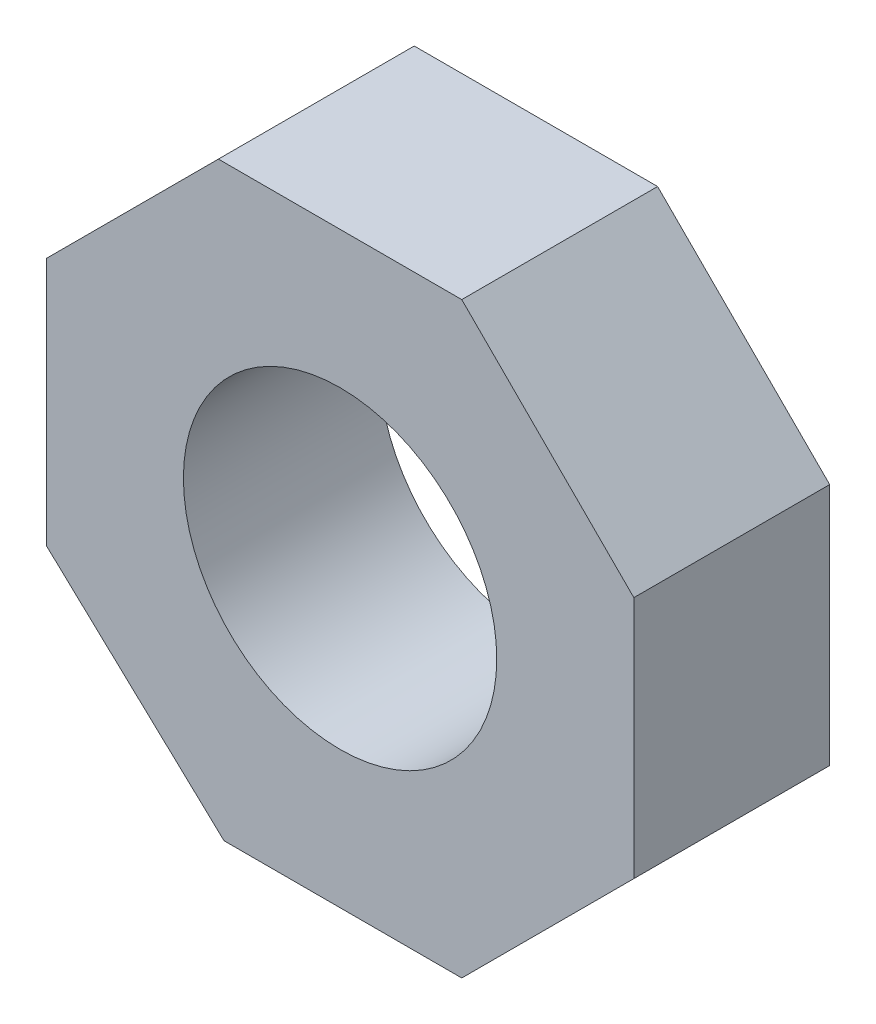
ISO-10303-21;
HEADER;
FILE_DESCRIPTION(('STEP AP214'),'2;1');
FILE_NAME('part.step','',(''),(''),'','','');
FILE_SCHEMA(('AUTOMOTIVE_DESIGN { 1 0 10303 214 1 1 1 1 }'));
ENDSEC;
DATA;
#1=APPLICATION_CONTEXT('core data for automotive mechanical design processes');
#2=APPLICATION_PROTOCOL_DEFINITION('international standard','automotive_design',2000,#1);
#3=PRODUCT_CONTEXT('',#1,'mechanical');
#4=PRODUCT('Part','Part','',(#3));
#5=PRODUCT_RELATED_PRODUCT_CATEGORY('part','',(#4));
#6=PRODUCT_DEFINITION_FORMATION('','',#4);
#7=PRODUCT_DEFINITION_CONTEXT('part definition',#1,'design');
#8=PRODUCT_DEFINITION('design','',#6,#7);
#9=PRODUCT_DEFINITION_SHAPE('','',#8);
#10=(LENGTH_UNIT() NAMED_UNIT(*) SI_UNIT(.MILLI.,.METRE.));
#11=(NAMED_UNIT(*) PLANE_ANGLE_UNIT() SI_UNIT($,.RADIAN.));
#12=(NAMED_UNIT(*) SI_UNIT($,.STERADIAN.) SOLID_ANGLE_UNIT());
#13=UNCERTAINTY_MEASURE_WITH_UNIT(LENGTH_MEASURE(1.E-05),#10,'distance_accuracy_value','');
#14=(GEOMETRIC_REPRESENTATION_CONTEXT(3) GLOBAL_UNCERTAINTY_ASSIGNED_CONTEXT((#13)) GLOBAL_UNIT_ASSIGNED_CONTEXT((#10,
#11,#12)) REPRESENTATION_CONTEXT('',''));
#15=CARTESIAN_POINT('',(0.,0.,0.));
#16=DIRECTION('',(0.,0.,1.));
#17=DIRECTION('',(1.,0.,0.));
#18=AXIS2_PLACEMENT_3D('',#15,#16,#17);
#19=CARTESIAN_POINT('',(-5.12900574695607,-5.46682549164767,5.));
#20=DIRECTION('',(0.68421491435658,0.729280433696132,0.));
#21=DIRECTION('',(-0.729280433696132,0.68421491435658,0.));
#22=AXIS2_PLACEMENT_3D('',#19,#20,#21);
#23=PLANE('',#22);
#24=DIRECTION('',(0.729280433696132,-0.68421491435658,0.));
#25=VECTOR('',#24,1.);
#26=CARTESIAN_POINT('',(-5.12900574695607,-5.46682549164767,0.));
#27=LINE('',#26,#25);
#28=CARTESIAN_POINT('',(-7.49999999999999,-3.2423456416064,0.));
#29=VERTEX_POINT('',#28);
#30=CARTESIAN_POINT('',(-2.96191707917186,-7.49999999999998,0.));
#31=VERTEX_POINT('',#30);
#32=EDGE_CURVE('E138',#29,#31,#27,.T.);
#33=ORIENTED_EDGE('',*,*,#32,.T.);
#34=DIRECTION('',(0.,0.,-1.));
#35=VECTOR('',#34,1.);
#36=CARTESIAN_POINT('',(-2.96191707917186,-7.49999999999998,5.));
#37=LINE('',#36,#35);
#38=CARTESIAN_POINT('',(-2.96191707917186,-7.49999999999998,5.));
#39=VERTEX_POINT('',#38);
#40=EDGE_CURVE('E11',#39,#31,#37,.T.);
#41=ORIENTED_EDGE('',*,*,#40,.F.);
#42=DIRECTION('',(0.729280433696132,-0.68421491435658,0.));
#43=VECTOR('',#42,1.);
#44=CARTESIAN_POINT('',(-5.12900574695607,-5.46682549164767,5.));
#45=LINE('',#44,#43);
#46=CARTESIAN_POINT('',(-7.49999999999999,-3.2423456416064,5.));
#47=VERTEX_POINT('',#46);
#48=EDGE_CURVE('E183',#47,#39,#45,.T.);
#49=ORIENTED_EDGE('',*,*,#48,.F.);
#50=DIRECTION('',(0.,0.,-1.));
#51=VECTOR('',#50,1.);
#52=CARTESIAN_POINT('',(-7.49999999999999,-3.2423456416064,5.));
#53=LINE('',#52,#51);
#54=EDGE_CURVE('E54',#47,#29,#53,.T.);
#55=ORIENTED_EDGE('',*,*,#54,.T.);
#56=EDGE_LOOP('',(#33,#41,#49,#55));
#57=FACE_BOUND('',#56,.T.);
#58=ADVANCED_FACE('F37',(#57),#23,.F.);
#59=CARTESIAN_POINT('',(0.,-7.49999999999998,5.));
#60=DIRECTION('',(0.,1.,0.));
#61=DIRECTION('',(-1.,0.,0.));
#62=AXIS2_PLACEMENT_3D('',#59,#60,#61);
#63=PLANE('',#62);
#64=DIRECTION('',(1.,0.,0.));
#65=VECTOR('',#64,1.);
#66=CARTESIAN_POINT('',(0.,-7.49999999999998,0.));
#67=LINE('',#66,#65);
#68=CARTESIAN_POINT('',(3.10660171779821,-7.49999999999998,0.));
#69=VERTEX_POINT('',#68);
#70=EDGE_CURVE('E140',#31,#69,#67,.T.);
#71=ORIENTED_EDGE('',*,*,#70,.T.);
#72=DIRECTION('',(0.,0.,-1.));
#73=VECTOR('',#72,1.);
#74=CARTESIAN_POINT('',(3.10660171779821,-7.49999999999998,5.));
#75=LINE('',#74,#73);
#76=CARTESIAN_POINT('',(3.10660171779821,-7.49999999999998,5.));
#77=VERTEX_POINT('',#76);
#78=EDGE_CURVE('E46',#77,#69,#75,.T.);
#79=ORIENTED_EDGE('',*,*,#78,.F.);
#80=DIRECTION('',(1.,0.,0.));
#81=VECTOR('',#80,1.);
#82=CARTESIAN_POINT('',(0.,-7.49999999999998,5.));
#83=LINE('',#82,#81);
#84=EDGE_CURVE('E92',#39,#77,#83,.T.);
#85=ORIENTED_EDGE('',*,*,#84,.F.);
#86=ORIENTED_EDGE('',*,*,#40,.T.);
#87=EDGE_LOOP('',(#71,#79,#85,#86));
#88=FACE_BOUND('',#87,.T.);
#89=ADVANCED_FACE('F171',(#88),#63,.F.);
#90=CARTESIAN_POINT('',(5.30330085889909,-5.3033008588991,5.));
#91=DIRECTION('',(0.707106781186547,-0.707106781186548,0.));
#92=DIRECTION('',(0.707106781186548,0.707106781186547,0.));
#93=AXIS2_PLACEMENT_3D('',#90,#91,#92);
#94=PLANE('',#93);
#95=DIRECTION('',(-0.707106781186548,-0.707106781186547,0.));
#96=VECTOR('',#95,1.);
#97=CARTESIAN_POINT('',(5.30330085889909,-5.3033008588991,0.));
#98=LINE('',#97,#96);
#99=CARTESIAN_POINT('',(7.49999999999998,-3.10660171779822,0.));
#100=VERTEX_POINT('',#99);
#101=EDGE_CURVE('E143',#100,#69,#98,.T.);
#102=ORIENTED_EDGE('',*,*,#101,.F.);
#103=DIRECTION('',(0.,0.,-1.));
#104=VECTOR('',#103,1.);
#105=CARTESIAN_POINT('',(7.49999999999998,-3.10660171779822,5.));
#106=LINE('',#105,#104);
#107=CARTESIAN_POINT('',(7.49999999999998,-3.10660171779822,5.));
#108=VERTEX_POINT('',#107);
#109=EDGE_CURVE('E164',#108,#100,#106,.T.);
#110=ORIENTED_EDGE('',*,*,#109,.F.);
#111=DIRECTION('',(-0.707106781186548,-0.707106781186547,0.));
#112=VECTOR('',#111,1.);
#113=CARTESIAN_POINT('',(5.30330085889909,-5.3033008588991,5.));
#114=LINE('',#113,#112);
#115=EDGE_CURVE('E170',#108,#77,#114,.T.);
#116=ORIENTED_EDGE('',*,*,#115,.T.);
#117=ORIENTED_EDGE('',*,*,#78,.T.);
#118=EDGE_LOOP('',(#102,#110,#116,#117));
#119=FACE_BOUND('',#118,.T.);
#120=ADVANCED_FACE('F168',(#119),#94,.T.);
#121=CARTESIAN_POINT('',(7.49999999999996,0.,5.));
#122=DIRECTION('',(1.,0.,0.));
#123=DIRECTION('',(0.,1.,0.));
#124=AXIS2_PLACEMENT_3D('',#121,#122,#123);
#125=PLANE('',#124);
#126=DIRECTION('',(0.,-1.,0.));
#127=VECTOR('',#126,1.);
#128=CARTESIAN_POINT('',(7.49999999999996,0.,0.));
#129=LINE('',#128,#127);
#130=CARTESIAN_POINT('',(7.49999999999994,3.10660171779828,0.));
#131=VERTEX_POINT('',#130);
#132=EDGE_CURVE('E146',#131,#100,#129,.T.);
#133=ORIENTED_EDGE('',*,*,#132,.F.);
#134=DIRECTION('',(0.,0.,-1.));
#135=VECTOR('',#134,1.);
#136=CARTESIAN_POINT('',(7.49999999999994,3.10660171779828,5.));
#137=LINE('',#136,#135);
#138=CARTESIAN_POINT('',(7.49999999999994,3.10660171779828,5.));
#139=VERTEX_POINT('',#138);
#140=EDGE_CURVE('E162',#139,#131,#137,.T.);
#141=ORIENTED_EDGE('',*,*,#140,.F.);
#142=DIRECTION('',(0.,-1.,0.));
#143=VECTOR('',#142,1.);
#144=CARTESIAN_POINT('',(7.49999999999996,0.,5.));
#145=LINE('',#144,#143);
#146=EDGE_CURVE('E180',#139,#108,#145,.T.);
#147=ORIENTED_EDGE('',*,*,#146,.T.);
#148=ORIENTED_EDGE('',*,*,#109,.T.);
#149=EDGE_LOOP('',(#133,#141,#147,#148));
#150=FACE_BOUND('',#149,.T.);
#151=ADVANCED_FACE('F178',(#150),#125,.T.);
#152=CARTESIAN_POINT('',(5.30330085889909,5.30330085889912,5.));
#153=DIRECTION('',(0.707106781186546,0.707106781186549,0.));
#154=DIRECTION('',(-0.707106781186549,0.707106781186546,0.));
#155=AXIS2_PLACEMENT_3D('',#152,#153,#154);
#156=PLANE('',#155);
#157=DIRECTION('',(0.707106781186549,-0.707106781186546,0.));
#158=VECTOR('',#157,1.);
#159=CARTESIAN_POINT('',(5.30330085889909,5.30330085889912,0.));
#160=LINE('',#159,#158);
#161=CARTESIAN_POINT('',(3.10660171779823,7.49999999999998,0.));
#162=VERTEX_POINT('',#161);
#163=EDGE_CURVE('E149',#162,#131,#160,.T.);
#164=ORIENTED_EDGE('',*,*,#163,.F.);
#165=DIRECTION('',(0.,0.,-1.));
#166=VECTOR('',#165,1.);
#167=CARTESIAN_POINT('',(3.10660171779823,7.49999999999998,5.));
#168=LINE('',#167,#166);
#169=CARTESIAN_POINT('',(3.10660171779823,7.49999999999998,5.));
#170=VERTEX_POINT('',#169);
#171=EDGE_CURVE('E117',#170,#162,#168,.T.);
#172=ORIENTED_EDGE('',*,*,#171,.F.);
#173=DIRECTION('',(0.707106781186549,-0.707106781186546,0.));
#174=VECTOR('',#173,1.);
#175=CARTESIAN_POINT('',(5.30330085889909,5.30330085889912,5.));
#176=LINE('',#175,#174);
#177=EDGE_CURVE('E127',#170,#139,#176,.T.);
#178=ORIENTED_EDGE('',*,*,#177,.T.);
#179=ORIENTED_EDGE('',*,*,#140,.T.);
#180=EDGE_LOOP('',(#164,#172,#178,#179));
#181=FACE_BOUND('',#180,.T.);
#182=ADVANCED_FACE('F187',(#181),#156,.T.);
#183=CARTESIAN_POINT('',(0.,7.49999999999999,5.));
#184=DIRECTION('',(0.,1.,0.));
#185=DIRECTION('',(-1.,0.,0.));
#186=AXIS2_PLACEMENT_3D('',#183,#184,#185);
#187=PLANE('',#186);
#188=DIRECTION('',(1.,0.,0.));
#189=VECTOR('',#188,1.);
#190=CARTESIAN_POINT('',(0.,7.49999999999999,0.));
#191=LINE('',#190,#189);
#192=CARTESIAN_POINT('',(-3.10660171779825,7.50000000000001,0.));
#193=VERTEX_POINT('',#192);
#194=EDGE_CURVE('E113',#193,#162,#191,.T.);
#195=ORIENTED_EDGE('',*,*,#194,.F.);
#196=DIRECTION('',(0.,0.,-1.));
#197=VECTOR('',#196,1.);
#198=CARTESIAN_POINT('',(-3.10660171779825,7.50000000000001,5.));
#199=LINE('',#198,#197);
#200=CARTESIAN_POINT('',(-3.10660171779825,7.50000000000001,5.));
#201=VERTEX_POINT('',#200);
#202=EDGE_CURVE('E108',#201,#193,#199,.T.);
#203=ORIENTED_EDGE('',*,*,#202,.F.);
#204=DIRECTION('',(1.,0.,0.));
#205=VECTOR('',#204,1.);
#206=CARTESIAN_POINT('',(0.,7.49999999999999,5.));
#207=LINE('',#206,#205);
#208=EDGE_CURVE('E111',#201,#170,#207,.T.);
#209=ORIENTED_EDGE('',*,*,#208,.T.);
#210=ORIENTED_EDGE('',*,*,#171,.T.);
#211=EDGE_LOOP('',(#195,#203,#209,#210));
#212=FACE_BOUND('',#211,.T.);
#213=ADVANCED_FACE('F110',(#212),#187,.T.);
#214=CARTESIAN_POINT('',(-5.30330085889916,5.30330085889906,5.));
#215=DIRECTION('',(-0.707106781186554,0.707106781186541,0.));
#216=DIRECTION('',(-0.707106781186541,-0.707106781186554,0.));
#217=AXIS2_PLACEMENT_3D('',#214,#215,#216);
#218=PLANE('',#217);
#219=DIRECTION('',(0.707106781186541,0.707106781186554,0.));
#220=VECTOR('',#219,1.);
#221=CARTESIAN_POINT('',(-5.30330085889916,5.30330085889906,0.));
#222=LINE('',#221,#220);
#223=CARTESIAN_POINT('',(-7.5,3.10660171779819,0.));
#224=VERTEX_POINT('',#223);
#225=EDGE_CURVE('E153',#224,#193,#222,.T.);
#226=ORIENTED_EDGE('',*,*,#225,.F.);
#227=DIRECTION('',(0.,0.,-1.));
#228=VECTOR('',#227,1.);
#229=CARTESIAN_POINT('',(-7.5,3.10660171779819,5.));
#230=LINE('',#229,#228);
#231=CARTESIAN_POINT('',(-7.5,3.10660171779819,5.));
#232=VERTEX_POINT('',#231);
#233=EDGE_CURVE('E80',#232,#224,#230,.T.);
#234=ORIENTED_EDGE('',*,*,#233,.F.);
#235=DIRECTION('',(0.707106781186541,0.707106781186554,0.));
#236=VECTOR('',#235,1.);
#237=CARTESIAN_POINT('',(-5.30330085889916,5.30330085889906,5.));
#238=LINE('',#237,#236);
#239=EDGE_CURVE('E124',#232,#201,#238,.T.);
#240=ORIENTED_EDGE('',*,*,#239,.T.);
#241=ORIENTED_EDGE('',*,*,#202,.T.);
#242=EDGE_LOOP('',(#226,#234,#240,#241));
#243=FACE_BOUND('',#242,.T.);
#244=ADVANCED_FACE('F129',(#243),#218,.T.);
#245=CARTESIAN_POINT('',(0.,0.,5.));
#246=DIRECTION('',(0.,0.,-1.));
#247=DIRECTION('',(-1.,0.,0.));
#248=AXIS2_PLACEMENT_3D('',#245,#246,#247);
#249=CYLINDRICAL_SURFACE('',#248,4.);
#250=CARTESIAN_POINT('',(0.,0.,5.));
#251=DIRECTION('',(0.,0.,1.));
#252=DIRECTION('',(1.,0.,0.));
#253=AXIS2_PLACEMENT_3D('',#250,#251,#252);
#254=CIRCLE('',#253,4.);
#255=CARTESIAN_POINT('',(4.,0.,5.));
#256=VERTEX_POINT('',#255);
#257=EDGE_CURVE('E158',#256,#256,#254,.T.);
#258=ORIENTED_EDGE('',*,*,#257,.T.);
#259=EDGE_LOOP('',(#258));
#260=FACE_BOUND('',#259,.T.);
#261=CARTESIAN_POINT('',(0.,0.,0.));
#262=DIRECTION('',(0.,0.,1.));
#263=DIRECTION('',(1.,0.,0.));
#264=AXIS2_PLACEMENT_3D('',#261,#262,#263);
#265=CIRCLE('',#264,4.);
#266=CARTESIAN_POINT('',(4.,0.,0.));
#267=VERTEX_POINT('',#266);
#268=EDGE_CURVE('E135',#267,#267,#265,.T.);
#269=ORIENTED_EDGE('',*,*,#268,.F.);
#270=EDGE_LOOP('',(#269));
#271=FACE_BOUND('',#270,.T.);
#272=ADVANCED_FACE('F39',(#260,#271),#249,.F.);
#273=CARTESIAN_POINT('',(-7.5,0.,5.));
#274=DIRECTION('',(-1.,0.,0.));
#275=DIRECTION('',(0.,-1.,0.));
#276=AXIS2_PLACEMENT_3D('',#273,#274,#275);
#277=PLANE('',#276);
#278=DIRECTION('',(0.,1.,0.));
#279=VECTOR('',#278,1.);
#280=CARTESIAN_POINT('',(-7.5,0.,0.));
#281=LINE('',#280,#279);
#282=EDGE_CURVE('E155',#29,#224,#281,.T.);
#283=ORIENTED_EDGE('',*,*,#282,.F.);
#284=ORIENTED_EDGE('',*,*,#54,.F.);
#285=DIRECTION('',(0.,1.,0.));
#286=VECTOR('',#285,1.);
#287=CARTESIAN_POINT('',(-7.5,0.,5.));
#288=LINE('',#287,#286);
#289=EDGE_CURVE('E130',#47,#232,#288,.T.);
#290=ORIENTED_EDGE('',*,*,#289,.T.);
#291=ORIENTED_EDGE('',*,*,#233,.T.);
#292=EDGE_LOOP('',(#283,#284,#290,#291));
#293=FACE_BOUND('',#292,.T.);
#294=ADVANCED_FACE('F188',(#293),#277,.T.);
#295=CARTESIAN_POINT('',(0.,0.,5.));
#296=DIRECTION('',(0.,0.,1.));
#297=DIRECTION('',(1.,0.,0.));
#298=AXIS2_PLACEMENT_3D('',#295,#296,#297);
#299=PLANE('',#298);
#300=ORIENTED_EDGE('',*,*,#257,.F.);
#301=EDGE_LOOP('',(#300));
#302=FACE_BOUND('',#301,.T.);
#303=ORIENTED_EDGE('',*,*,#48,.T.);
#304=ORIENTED_EDGE('',*,*,#84,.T.);
#305=ORIENTED_EDGE('',*,*,#115,.F.);
#306=ORIENTED_EDGE('',*,*,#146,.F.);
#307=ORIENTED_EDGE('',*,*,#177,.F.);
#308=ORIENTED_EDGE('',*,*,#208,.F.);
#309=ORIENTED_EDGE('',*,*,#239,.F.);
#310=ORIENTED_EDGE('',*,*,#289,.F.);
#311=EDGE_LOOP('',(#303,#304,#305,#306,#307,#308,#309,#310));
#312=FACE_BOUND('',#311,.T.);
#313=ADVANCED_FACE('F122',(#302,#312),#299,.T.);
#314=CARTESIAN_POINT('',(0.,0.,0.));
#315=DIRECTION('',(0.,0.,1.));
#316=DIRECTION('',(1.,0.,0.));
#317=AXIS2_PLACEMENT_3D('',#314,#315,#316);
#318=PLANE('',#317);
#319=ORIENTED_EDGE('',*,*,#268,.T.);
#320=EDGE_LOOP('',(#319));
#321=FACE_BOUND('',#320,.T.);
#322=ORIENTED_EDGE('',*,*,#32,.F.);
#323=ORIENTED_EDGE('',*,*,#282,.T.);
#324=ORIENTED_EDGE('',*,*,#225,.T.);
#325=ORIENTED_EDGE('',*,*,#194,.T.);
#326=ORIENTED_EDGE('',*,*,#163,.T.);
#327=ORIENTED_EDGE('',*,*,#132,.T.);
#328=ORIENTED_EDGE('',*,*,#101,.T.);
#329=ORIENTED_EDGE('',*,*,#70,.F.);
#330=EDGE_LOOP('',(#322,#323,#324,#325,#326,#327,#328,#329));
#331=FACE_BOUND('',#330,.T.);
#332=ADVANCED_FACE('F174',(#321,#331),#318,.F.);
#333=CLOSED_SHELL('',(#58,#89,#120,#151,#182,#213,#244,#272,#294,#313,#332));
#334=MANIFOLD_SOLID_BREP('B2',#333);
#335=ADVANCED_BREP_SHAPE_REPRESENTATION('',(#18,#334),#14);
#336=SHAPE_DEFINITION_REPRESENTATION(#9,#335);
ENDSEC;
END-ISO-10303-21;
